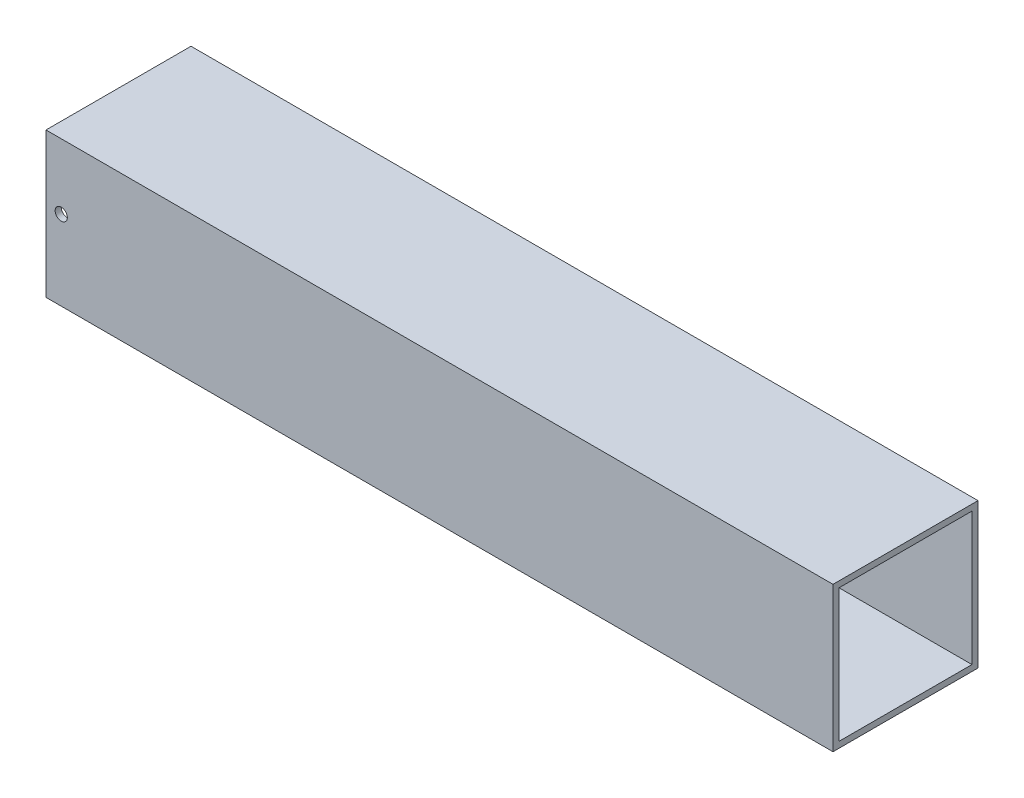
ISO-10303-21;
HEADER;
FILE_DESCRIPTION(('STEP AP214'),'2;1');
FILE_NAME('part.step','',(''),(''),'','','');
FILE_SCHEMA(('AUTOMOTIVE_DESIGN { 1 0 10303 214 1 1 1 1 }'));
ENDSEC;
DATA;
#1=APPLICATION_CONTEXT('core data for automotive mechanical design processes');
#2=APPLICATION_PROTOCOL_DEFINITION('international standard','automotive_design',2000,#1);
#3=PRODUCT_CONTEXT('',#1,'mechanical');
#4=PRODUCT('Part','Part','',(#3));
#5=PRODUCT_RELATED_PRODUCT_CATEGORY('part','',(#4));
#6=PRODUCT_DEFINITION_FORMATION('','',#4);
#7=PRODUCT_DEFINITION_CONTEXT('part definition',#1,'design');
#8=PRODUCT_DEFINITION('design','',#6,#7);
#9=PRODUCT_DEFINITION_SHAPE('','',#8);
#10=(LENGTH_UNIT() NAMED_UNIT(*) SI_UNIT(.MILLI.,.METRE.));
#11=(NAMED_UNIT(*) PLANE_ANGLE_UNIT() SI_UNIT($,.RADIAN.));
#12=(NAMED_UNIT(*) SI_UNIT($,.STERADIAN.) SOLID_ANGLE_UNIT());
#13=UNCERTAINTY_MEASURE_WITH_UNIT(LENGTH_MEASURE(1.E-05),#10,'distance_accuracy_value','');
#14=(GEOMETRIC_REPRESENTATION_CONTEXT(3) GLOBAL_UNCERTAINTY_ASSIGNED_CONTEXT((#13)) GLOBAL_UNIT_ASSIGNED_CONTEXT((#10,
#11,#12)) REPRESENTATION_CONTEXT('',''));
#15=CARTESIAN_POINT('',(0.,0.,0.));
#16=DIRECTION('',(0.,0.,1.));
#17=DIRECTION('',(1.,0.,0.));
#18=AXIS2_PLACEMENT_3D('',#15,#16,#17);
#19=CARTESIAN_POINT('',(-206.780874971429,-17.4625,0.));
#20=DIRECTION('',(0.,-1.,0.));
#21=DIRECTION('',(0.,0.,-1.));
#22=AXIS2_PLACEMENT_3D('',#19,#20,#21);
#23=PLANE('',#22);
#24=DIRECTION('',(0.,0.,-1.));
#25=VECTOR('',#24,1.);
#26=CARTESIAN_POINT('',(0.,-17.4625,0.));
#27=LINE('',#26,#25);
#28=CARTESIAN_POINT('',(0.,-17.4625,17.4625));
#29=VERTEX_POINT('',#28);
#30=CARTESIAN_POINT('',(0.,-17.4625,-17.4625));
#31=VERTEX_POINT('',#30);
#32=EDGE_CURVE('E147',#29,#31,#27,.T.);
#33=ORIENTED_EDGE('',*,*,#32,.T.);
#34=DIRECTION('',(1.,0.,0.));
#35=VECTOR('',#34,1.);
#36=CARTESIAN_POINT('',(-206.780874971429,-17.4625,-17.4625));
#37=LINE('',#36,#35);
#38=CARTESIAN_POINT('',(-206.780874971429,-17.4625,-17.4625));
#39=VERTEX_POINT('',#38);
#40=EDGE_CURVE('E11',#39,#31,#37,.T.);
#41=ORIENTED_EDGE('',*,*,#40,.F.);
#42=DIRECTION('',(0.,0.,-1.));
#43=VECTOR('',#42,1.);
#44=CARTESIAN_POINT('',(-206.780874971429,-17.4625,0.));
#45=LINE('',#44,#43);
#46=CARTESIAN_POINT('',(-206.780874971429,-17.4625,17.4625));
#47=VERTEX_POINT('',#46);
#48=EDGE_CURVE('E128',#47,#39,#45,.T.);
#49=ORIENTED_EDGE('',*,*,#48,.F.);
#50=DIRECTION('',(1.,0.,0.));
#51=VECTOR('',#50,1.);
#52=CARTESIAN_POINT('',(-206.780874971429,-17.4625,17.4625));
#53=LINE('',#52,#51);
#54=EDGE_CURVE('E119',#47,#29,#53,.T.);
#55=ORIENTED_EDGE('',*,*,#54,.T.);
#56=EDGE_LOOP('',(#33,#41,#49,#55));
#57=FACE_BOUND('',#56,.T.);
#58=ADVANCED_FACE('F37',(#57),#23,.F.);
#59=CARTESIAN_POINT('',(-206.780874971429,0.,-17.4625));
#60=DIRECTION('',(0.,0.,-1.));
#61=DIRECTION('',(-1.,0.,0.));
#62=AXIS2_PLACEMENT_3D('',#59,#60,#61);
#63=PLANE('',#62);
#64=CARTESIAN_POINT('',(-202.780874971429,1.89875,-17.4625));
#65=DIRECTION('',(0.,0.,-1.));
#66=DIRECTION('',(-1.,0.,0.));
#67=AXIS2_PLACEMENT_3D('',#64,#65,#66);
#68=CIRCLE('',#67,1.59999999999999);
#69=CARTESIAN_POINT('',(-204.380874971429,1.89875,-17.4625));
#70=VERTEX_POINT('',#69);
#71=EDGE_CURVE('E192',#70,#70,#68,.T.);
#72=ORIENTED_EDGE('',*,*,#71,.T.);
#73=EDGE_LOOP('',(#72));
#74=FACE_BOUND('',#73,.T.);
#75=DIRECTION('',(0.,1.,0.));
#76=VECTOR('',#75,1.);
#77=CARTESIAN_POINT('',(0.,0.,-17.4625));
#78=LINE('',#77,#76);
#79=CARTESIAN_POINT('',(0.,17.4625,-17.4625));
#80=VERTEX_POINT('',#79);
#81=EDGE_CURVE('E89',#31,#80,#78,.T.);
#82=ORIENTED_EDGE('',*,*,#81,.T.);
#83=DIRECTION('',(1.,0.,0.));
#84=VECTOR('',#83,1.);
#85=CARTESIAN_POINT('',(-206.780874971429,17.4625,-17.4625));
#86=LINE('',#85,#84);
#87=CARTESIAN_POINT('',(-206.780874971429,17.4625,-17.4625));
#88=VERTEX_POINT('',#87);
#89=EDGE_CURVE('E47',#88,#80,#86,.T.);
#90=ORIENTED_EDGE('',*,*,#89,.F.);
#91=DIRECTION('',(0.,1.,0.));
#92=VECTOR('',#91,1.);
#93=CARTESIAN_POINT('',(-206.780874971429,0.,-17.4625));
#94=LINE('',#93,#92);
#95=EDGE_CURVE('E55',#39,#88,#94,.T.);
#96=ORIENTED_EDGE('',*,*,#95,.F.);
#97=ORIENTED_EDGE('',*,*,#40,.T.);
#98=EDGE_LOOP('',(#82,#90,#96,#97));
#99=FACE_BOUND('',#98,.T.);
#100=ADVANCED_FACE('F196',(#74,#99),#63,.F.);
#101=CARTESIAN_POINT('',(-206.780874971429,17.4625,0.));
#102=DIRECTION('',(0.,-1.,0.));
#103=DIRECTION('',(0.,0.,-1.));
#104=AXIS2_PLACEMENT_3D('',#101,#102,#103);
#105=PLANE('',#104);
#106=DIRECTION('',(0.,0.,-1.));
#107=VECTOR('',#106,1.);
#108=CARTESIAN_POINT('',(0.,17.4625,0.));
#109=LINE('',#108,#107);
#110=CARTESIAN_POINT('',(0.,17.4625,17.4625));
#111=VERTEX_POINT('',#110);
#112=EDGE_CURVE('E114',#111,#80,#109,.T.);
#113=ORIENTED_EDGE('',*,*,#112,.F.);
#114=DIRECTION('',(1.,0.,0.));
#115=VECTOR('',#114,1.);
#116=CARTESIAN_POINT('',(-206.780874971429,17.4625,17.4625));
#117=LINE('',#116,#115);
#118=CARTESIAN_POINT('',(-206.780874971429,17.4625,17.4625));
#119=VERTEX_POINT('',#118);
#120=EDGE_CURVE('E110',#119,#111,#117,.T.);
#121=ORIENTED_EDGE('',*,*,#120,.F.);
#122=DIRECTION('',(0.,0.,-1.));
#123=VECTOR('',#122,1.);
#124=CARTESIAN_POINT('',(-206.780874971429,17.4625,0.));
#125=LINE('',#124,#123);
#126=EDGE_CURVE('E113',#119,#88,#125,.T.);
#127=ORIENTED_EDGE('',*,*,#126,.T.);
#128=ORIENTED_EDGE('',*,*,#89,.T.);
#129=EDGE_LOOP('',(#113,#121,#127,#128));
#130=FACE_BOUND('',#129,.T.);
#131=ADVANCED_FACE('F112',(#130),#105,.T.);
#132=CARTESIAN_POINT('',(-206.780874971429,-19.05,0.));
#133=DIRECTION('',(0.,-1.,0.));
#134=DIRECTION('',(0.,0.,-1.));
#135=AXIS2_PLACEMENT_3D('',#132,#133,#134);
#136=PLANE('',#135);
#137=DIRECTION('',(0.,0.,-1.));
#138=VECTOR('',#137,1.);
#139=CARTESIAN_POINT('',(0.,-19.05,0.));
#140=LINE('',#139,#138);
#141=CARTESIAN_POINT('',(0.,-19.05,19.05));
#142=VERTEX_POINT('',#141);
#143=CARTESIAN_POINT('',(0.,-19.05,-19.05));
#144=VERTEX_POINT('',#143);
#145=EDGE_CURVE('E135',#142,#144,#140,.T.);
#146=ORIENTED_EDGE('',*,*,#145,.F.);
#147=DIRECTION('',(1.,0.,0.));
#148=VECTOR('',#147,1.);
#149=CARTESIAN_POINT('',(-206.780874971429,-19.05,19.05));
#150=LINE('',#149,#148);
#151=CARTESIAN_POINT('',(-206.780874971429,-19.05,19.05));
#152=VERTEX_POINT('',#151);
#153=EDGE_CURVE('E157',#152,#142,#150,.T.);
#154=ORIENTED_EDGE('',*,*,#153,.F.);
#155=DIRECTION('',(0.,0.,-1.));
#156=VECTOR('',#155,1.);
#157=CARTESIAN_POINT('',(-206.780874971429,-19.05,0.));
#158=LINE('',#157,#156);
#159=CARTESIAN_POINT('',(-206.780874971429,-19.05,-19.05));
#160=VERTEX_POINT('',#159);
#161=EDGE_CURVE('E153',#152,#160,#158,.T.);
#162=ORIENTED_EDGE('',*,*,#161,.T.);
#163=DIRECTION('',(1.,0.,0.));
#164=VECTOR('',#163,1.);
#165=CARTESIAN_POINT('',(-206.780874971429,-19.05,-19.05));
#166=LINE('',#165,#164);
#167=EDGE_CURVE('E96',#160,#144,#166,.T.);
#168=ORIENTED_EDGE('',*,*,#167,.T.);
#169=EDGE_LOOP('',(#146,#154,#162,#168));
#170=FACE_BOUND('',#169,.T.);
#171=ADVANCED_FACE('F39',(#170),#136,.T.);
#172=CARTESIAN_POINT('',(-206.780874971429,0.,19.05));
#173=DIRECTION('',(0.,0.,-1.));
#174=DIRECTION('',(-1.,0.,0.));
#175=AXIS2_PLACEMENT_3D('',#172,#173,#174);
#176=PLANE('',#175);
#177=CARTESIAN_POINT('',(-202.780874971429,1.89875,19.05));
#178=DIRECTION('',(0.,0.,-1.));
#179=DIRECTION('',(-1.,0.,0.));
#180=AXIS2_PLACEMENT_3D('',#177,#178,#179);
#181=CIRCLE('',#180,1.59999999999999);
#182=CARTESIAN_POINT('',(-204.380874971429,1.89875,19.05));
#183=VERTEX_POINT('',#182);
#184=EDGE_CURVE('E139',#183,#183,#181,.T.);
#185=ORIENTED_EDGE('',*,*,#184,.T.);
#186=EDGE_LOOP('',(#185));
#187=FACE_BOUND('',#186,.T.);
#188=DIRECTION('',(0.,1.,0.));
#189=VECTOR('',#188,1.);
#190=CARTESIAN_POINT('',(0.,0.,19.05));
#191=LINE('',#190,#189);
#192=CARTESIAN_POINT('',(0.,19.05,19.05));
#193=VERTEX_POINT('',#192);
#194=EDGE_CURVE('E145',#142,#193,#191,.T.);
#195=ORIENTED_EDGE('',*,*,#194,.T.);
#196=DIRECTION('',(1.,0.,0.));
#197=VECTOR('',#196,1.);
#198=CARTESIAN_POINT('',(-206.780874971429,19.05,19.05));
#199=LINE('',#198,#197);
#200=CARTESIAN_POINT('',(-206.780874971429,19.05,19.05));
#201=VERTEX_POINT('',#200);
#202=EDGE_CURVE('E159',#201,#193,#199,.T.);
#203=ORIENTED_EDGE('',*,*,#202,.F.);
#204=DIRECTION('',(0.,1.,0.));
#205=VECTOR('',#204,1.);
#206=CARTESIAN_POINT('',(-206.780874971429,0.,19.05));
#207=LINE('',#206,#205);
#208=EDGE_CURVE('E130',#152,#201,#207,.T.);
#209=ORIENTED_EDGE('',*,*,#208,.F.);
#210=ORIENTED_EDGE('',*,*,#153,.T.);
#211=EDGE_LOOP('',(#195,#203,#209,#210));
#212=FACE_BOUND('',#211,.T.);
#213=ADVANCED_FACE('F175',(#187,#212),#176,.F.);
#214=CARTESIAN_POINT('',(-206.780874971429,19.05,0.));
#215=DIRECTION('',(0.,-1.,0.));
#216=DIRECTION('',(0.,0.,-1.));
#217=AXIS2_PLACEMENT_3D('',#214,#215,#216);
#218=PLANE('',#217);
#219=DIRECTION('',(0.,0.,-1.));
#220=VECTOR('',#219,1.);
#221=CARTESIAN_POINT('',(0.,19.05,0.));
#222=LINE('',#221,#220);
#223=CARTESIAN_POINT('',(0.,19.05,-19.05));
#224=VERTEX_POINT('',#223);
#225=EDGE_CURVE('E142',#193,#224,#222,.T.);
#226=ORIENTED_EDGE('',*,*,#225,.T.);
#227=DIRECTION('',(1.,0.,0.));
#228=VECTOR('',#227,1.);
#229=CARTESIAN_POINT('',(-206.780874971429,19.05,-19.05));
#230=LINE('',#229,#228);
#231=CARTESIAN_POINT('',(-206.780874971429,19.05,-19.05));
#232=VERTEX_POINT('',#231);
#233=EDGE_CURVE('E162',#232,#224,#230,.T.);
#234=ORIENTED_EDGE('',*,*,#233,.F.);
#235=DIRECTION('',(0.,0.,-1.));
#236=VECTOR('',#235,1.);
#237=CARTESIAN_POINT('',(-206.780874971429,19.05,0.));
#238=LINE('',#237,#236);
#239=EDGE_CURVE('E180',#201,#232,#238,.T.);
#240=ORIENTED_EDGE('',*,*,#239,.F.);
#241=ORIENTED_EDGE('',*,*,#202,.T.);
#242=EDGE_LOOP('',(#226,#234,#240,#241));
#243=FACE_BOUND('',#242,.T.);
#244=ADVANCED_FACE('F179',(#243),#218,.F.);
#245=CARTESIAN_POINT('',(-206.780874971429,0.,-19.05));
#246=DIRECTION('',(0.,0.,-1.));
#247=DIRECTION('',(-1.,0.,0.));
#248=AXIS2_PLACEMENT_3D('',#245,#246,#247);
#249=PLANE('',#248);
#250=CARTESIAN_POINT('',(-202.780874971429,1.89875,-19.05));
#251=DIRECTION('',(0.,0.,-1.));
#252=DIRECTION('',(-1.,0.,0.));
#253=AXIS2_PLACEMENT_3D('',#250,#251,#252);
#254=CIRCLE('',#253,1.59999999999999);
#255=CARTESIAN_POINT('',(-204.380874971429,1.89875,-19.05));
#256=VERTEX_POINT('',#255);
#257=EDGE_CURVE('E189',#256,#256,#254,.T.);
#258=ORIENTED_EDGE('',*,*,#257,.F.);
#259=EDGE_LOOP('',(#258));
#260=FACE_BOUND('',#259,.T.);
#261=DIRECTION('',(0.,1.,0.));
#262=VECTOR('',#261,1.);
#263=CARTESIAN_POINT('',(0.,0.,-19.05));
#264=LINE('',#263,#262);
#265=EDGE_CURVE('E138',#144,#224,#264,.T.);
#266=ORIENTED_EDGE('',*,*,#265,.F.);
#267=ORIENTED_EDGE('',*,*,#167,.F.);
#268=DIRECTION('',(0.,1.,0.));
#269=VECTOR('',#268,1.);
#270=CARTESIAN_POINT('',(-206.780874971429,0.,-19.05));
#271=LINE('',#270,#269);
#272=EDGE_CURVE('E182',#160,#232,#271,.T.);
#273=ORIENTED_EDGE('',*,*,#272,.T.);
#274=ORIENTED_EDGE('',*,*,#233,.T.);
#275=EDGE_LOOP('',(#266,#267,#273,#274));
#276=FACE_BOUND('',#275,.T.);
#277=ADVANCED_FACE('F167',(#260,#276),#249,.T.);
#278=CARTESIAN_POINT('',(-206.780874971429,0.,17.4625));
#279=DIRECTION('',(0.,0.,-1.));
#280=DIRECTION('',(-1.,0.,0.));
#281=AXIS2_PLACEMENT_3D('',#278,#279,#280);
#282=PLANE('',#281);
#283=CARTESIAN_POINT('',(-202.780874971429,1.89875,17.4625));
#284=DIRECTION('',(0.,0.,-1.));
#285=DIRECTION('',(-1.,0.,0.));
#286=AXIS2_PLACEMENT_3D('',#283,#284,#285);
#287=CIRCLE('',#286,1.59999999999999);
#288=CARTESIAN_POINT('',(-204.380874971429,1.89875,17.4625));
#289=VERTEX_POINT('',#288);
#290=EDGE_CURVE('E41',#289,#289,#287,.T.);
#291=ORIENTED_EDGE('',*,*,#290,.F.);
#292=EDGE_LOOP('',(#291));
#293=FACE_BOUND('',#292,.T.);
#294=DIRECTION('',(0.,1.,0.));
#295=VECTOR('',#294,1.);
#296=CARTESIAN_POINT('',(0.,0.,17.4625));
#297=LINE('',#296,#295);
#298=EDGE_CURVE('E150',#29,#111,#297,.T.);
#299=ORIENTED_EDGE('',*,*,#298,.F.);
#300=ORIENTED_EDGE('',*,*,#54,.F.);
#301=DIRECTION('',(0.,1.,0.));
#302=VECTOR('',#301,1.);
#303=CARTESIAN_POINT('',(-206.780874971429,0.,17.4625));
#304=LINE('',#303,#302);
#305=EDGE_CURVE('E124',#47,#119,#304,.T.);
#306=ORIENTED_EDGE('',*,*,#305,.T.);
#307=ORIENTED_EDGE('',*,*,#120,.T.);
#308=EDGE_LOOP('',(#299,#300,#306,#307));
#309=FACE_BOUND('',#308,.T.);
#310=ADVANCED_FACE('F126',(#293,#309),#282,.T.);
#311=CARTESIAN_POINT('',(-206.780874971429,0.,0.));
#312=DIRECTION('',(1.,0.,0.));
#313=DIRECTION('',(0.,0.,-1.));
#314=AXIS2_PLACEMENT_3D('',#311,#312,#313);
#315=PLANE('',#314);
#316=ORIENTED_EDGE('',*,*,#161,.F.);
#317=ORIENTED_EDGE('',*,*,#208,.T.);
#318=ORIENTED_EDGE('',*,*,#239,.T.);
#319=ORIENTED_EDGE('',*,*,#272,.F.);
#320=EDGE_LOOP('',(#316,#317,#318,#319));
#321=FACE_BOUND('',#320,.T.);
#322=ORIENTED_EDGE('',*,*,#48,.T.);
#323=ORIENTED_EDGE('',*,*,#95,.T.);
#324=ORIENTED_EDGE('',*,*,#126,.F.);
#325=ORIENTED_EDGE('',*,*,#305,.F.);
#326=EDGE_LOOP('',(#322,#323,#324,#325));
#327=FACE_BOUND('',#326,.T.);
#328=ADVANCED_FACE('F123',(#321,#327),#315,.F.);
#329=CARTESIAN_POINT('',(0.,0.,0.));
#330=DIRECTION('',(1.,0.,0.));
#331=DIRECTION('',(0.,0.,-1.));
#332=AXIS2_PLACEMENT_3D('',#329,#330,#331);
#333=PLANE('',#332);
#334=ORIENTED_EDGE('',*,*,#145,.T.);
#335=ORIENTED_EDGE('',*,*,#265,.T.);
#336=ORIENTED_EDGE('',*,*,#225,.F.);
#337=ORIENTED_EDGE('',*,*,#194,.F.);
#338=EDGE_LOOP('',(#334,#335,#336,#337));
#339=FACE_BOUND('',#338,.T.);
#340=ORIENTED_EDGE('',*,*,#32,.F.);
#341=ORIENTED_EDGE('',*,*,#298,.T.);
#342=ORIENTED_EDGE('',*,*,#112,.T.);
#343=ORIENTED_EDGE('',*,*,#81,.F.);
#344=EDGE_LOOP('',(#340,#341,#342,#343));
#345=FACE_BOUND('',#344,.T.);
#346=ADVANCED_FACE('F172',(#339,#345),#333,.T.);
#347=CARTESIAN_POINT('',(-202.780874971429,1.89875,21.35));
#348=DIRECTION('',(0.,0.,1.));
#349=DIRECTION('',(1.,0.,0.));
#350=AXIS2_PLACEMENT_3D('',#347,#348,#349);
#351=CYLINDRICAL_SURFACE('',#350,1.59999999999999);
#352=ORIENTED_EDGE('',*,*,#290,.T.);
#353=EDGE_LOOP('',(#352));
#354=FACE_BOUND('',#353,.T.);
#355=ORIENTED_EDGE('',*,*,#184,.F.);
#356=EDGE_LOOP('',(#355));
#357=FACE_BOUND('',#356,.T.);
#358=ADVANCED_FACE('F201',(#354,#357),#351,.F.);
#359=CARTESIAN_POINT('',(-202.780874971429,1.89875,-21.35));
#360=DIRECTION('',(0.,0.,-1.));
#361=DIRECTION('',(1.,0.,0.));
#362=AXIS2_PLACEMENT_3D('',#359,#360,#361);
#363=CYLINDRICAL_SURFACE('',#362,1.59999999999999);
#364=ORIENTED_EDGE('',*,*,#71,.F.);
#365=EDGE_LOOP('',(#364));
#366=FACE_BOUND('',#365,.T.);
#367=ORIENTED_EDGE('',*,*,#257,.T.);
#368=EDGE_LOOP('',(#367));
#369=FACE_BOUND('',#368,.T.);
#370=ADVANCED_FACE('F198',(#366,#369),#363,.F.);
#371=CLOSED_SHELL('',(#58,#100,#131,#171,#213,#244,#277,#310,#328,#346,#358,#370));
#372=MANIFOLD_SOLID_BREP('B2',#371);
#373=ADVANCED_BREP_SHAPE_REPRESENTATION('',(#18,#372),#14);
#374=SHAPE_DEFINITION_REPRESENTATION(#9,#373);
ENDSEC;
END-ISO-10303-21;
